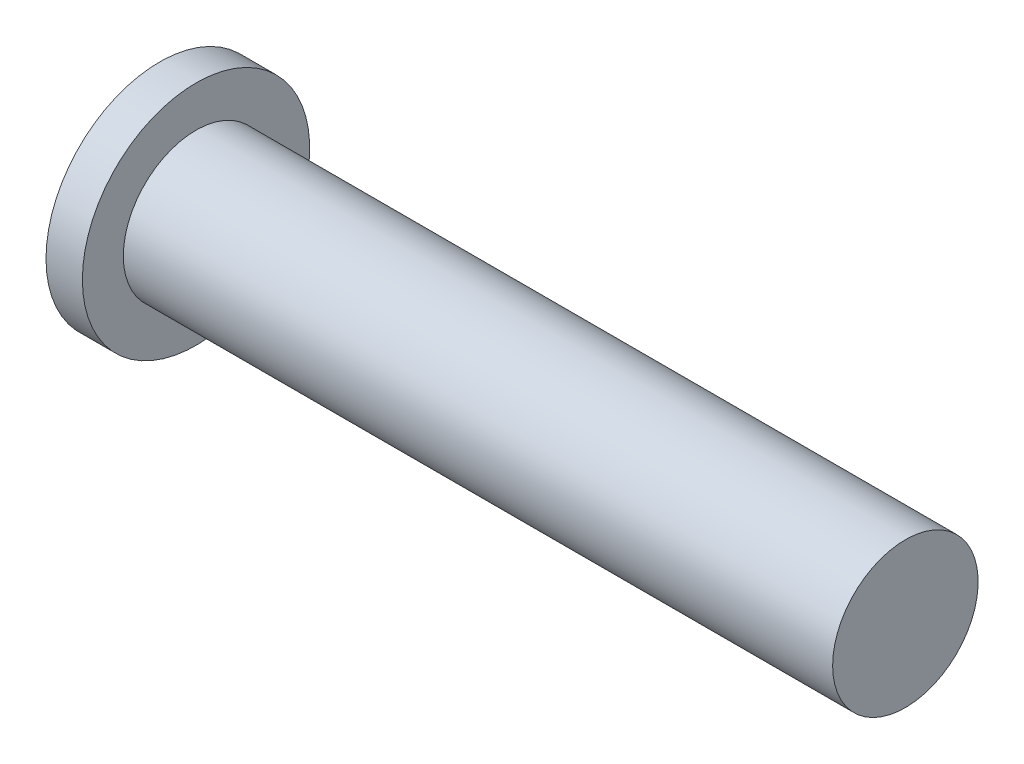
ISO-10303-21;
HEADER;
FILE_DESCRIPTION(('STEP AP214'),'2;1');
FILE_NAME('part.step','',(''),(''),'','','');
FILE_SCHEMA(('AUTOMOTIVE_DESIGN { 1 0 10303 214 1 1 1 1 }'));
ENDSEC;
DATA;
#1=APPLICATION_CONTEXT('core data for automotive mechanical design processes');
#2=APPLICATION_PROTOCOL_DEFINITION('international standard','automotive_design',2000,#1);
#3=PRODUCT_CONTEXT('',#1,'mechanical');
#4=PRODUCT('Part','Part','',(#3));
#5=PRODUCT_RELATED_PRODUCT_CATEGORY('part','',(#4));
#6=PRODUCT_DEFINITION_FORMATION('','',#4);
#7=PRODUCT_DEFINITION_CONTEXT('part definition',#1,'design');
#8=PRODUCT_DEFINITION('design','',#6,#7);
#9=PRODUCT_DEFINITION_SHAPE('','',#8);
#10=(LENGTH_UNIT() NAMED_UNIT(*) SI_UNIT(.MILLI.,.METRE.));
#11=(NAMED_UNIT(*) PLANE_ANGLE_UNIT() SI_UNIT($,.RADIAN.));
#12=(NAMED_UNIT(*) SI_UNIT($,.STERADIAN.) SOLID_ANGLE_UNIT());
#13=UNCERTAINTY_MEASURE_WITH_UNIT(LENGTH_MEASURE(1.E-05),#10,'distance_accuracy_value','');
#14=(GEOMETRIC_REPRESENTATION_CONTEXT(3) GLOBAL_UNCERTAINTY_ASSIGNED_CONTEXT((#13)) GLOBAL_UNIT_ASSIGNED_CONTEXT((#10,
#11,#12)) REPRESENTATION_CONTEXT('',''));
#15=CARTESIAN_POINT('',(0.,0.,0.));
#16=DIRECTION('',(0.,0.,1.));
#17=DIRECTION('',(1.,0.,0.));
#18=AXIS2_PLACEMENT_3D('',#15,#16,#17);
#19=CARTESIAN_POINT('',(0.,0.,0.));
#20=DIRECTION('',(1.,0.,0.));
#21=DIRECTION('',(0.,0.,-1.));
#22=AXIS2_PLACEMENT_3D('',#19,#20,#21);
#23=PLANE('',#22);
#24=CARTESIAN_POINT('',(0.,0.,0.));
#25=DIRECTION('',(-1.,0.,0.));
#26=DIRECTION('',(0.,0.,1.));
#27=AXIS2_PLACEMENT_3D('',#24,#25,#26);
#28=CIRCLE('',#27,6.25);
#29=CARTESIAN_POINT('',(0.,0.,6.25));
#30=VERTEX_POINT('',#29);
#31=EDGE_CURVE('E10',#30,#30,#28,.T.);
#32=ORIENTED_EDGE('',*,*,#31,.T.);
#33=EDGE_LOOP('',(#32));
#34=FACE_BOUND('',#33,.T.);
#35=ADVANCED_FACE('F31',(#34),#23,.F.);
#36=CARTESIAN_POINT('',(0.,0.,0.));
#37=DIRECTION('',(-1.,0.,0.));
#38=DIRECTION('',(0.,0.,1.));
#39=AXIS2_PLACEMENT_3D('',#36,#37,#38);
#40=CYLINDRICAL_SURFACE('',#39,6.25);
#41=ORIENTED_EDGE('',*,*,#31,.F.);
#42=EDGE_LOOP('',(#41));
#43=FACE_BOUND('',#42,.T.);
#44=CARTESIAN_POINT('',(2.,0.,0.));
#45=DIRECTION('',(-1.,0.,0.));
#46=DIRECTION('',(0.,0.,1.));
#47=AXIS2_PLACEMENT_3D('',#44,#45,#46);
#48=CIRCLE('',#47,6.25);
#49=CARTESIAN_POINT('',(2.,0.,6.25));
#50=VERTEX_POINT('',#49);
#51=EDGE_CURVE('E37',#50,#50,#48,.T.);
#52=ORIENTED_EDGE('',*,*,#51,.T.);
#53=EDGE_LOOP('',(#52));
#54=FACE_BOUND('',#53,.T.);
#55=ADVANCED_FACE('F63',(#43,#54),#40,.T.);
#56=CARTESIAN_POINT('',(2.,0.,-6.25));
#57=DIRECTION('',(-1.,0.,0.));
#58=DIRECTION('',(0.,0.,1.));
#59=AXIS2_PLACEMENT_3D('',#56,#57,#58);
#60=PLANE('',#59);
#61=ORIENTED_EDGE('',*,*,#51,.F.);
#62=EDGE_LOOP('',(#61));
#63=FACE_BOUND('',#62,.T.);
#64=CARTESIAN_POINT('',(2.,0.,0.));
#65=DIRECTION('',(-1.,0.,0.));
#66=DIRECTION('',(0.,0.,1.));
#67=AXIS2_PLACEMENT_3D('',#64,#65,#66);
#68=CIRCLE('',#67,3.99999999999999);
#69=CARTESIAN_POINT('',(2.,0.,3.99999999999999));
#70=VERTEX_POINT('',#69);
#71=EDGE_CURVE('E41',#70,#70,#68,.T.);
#72=ORIENTED_EDGE('',*,*,#71,.T.);
#73=EDGE_LOOP('',(#72));
#74=FACE_BOUND('',#73,.T.);
#75=ADVANCED_FACE('F59',(#63,#74),#60,.F.);
#76=CARTESIAN_POINT('',(0.,0.,0.));
#77=DIRECTION('',(-1.,0.,0.));
#78=DIRECTION('',(0.,0.,1.));
#79=AXIS2_PLACEMENT_3D('',#76,#77,#78);
#80=CYLINDRICAL_SURFACE('',#79,3.99999999999999);
#81=ORIENTED_EDGE('',*,*,#71,.F.);
#82=EDGE_LOOP('',(#81));
#83=FACE_BOUND('',#82,.T.);
#84=CARTESIAN_POINT('',(41.,0.,0.));
#85=DIRECTION('',(-1.,0.,0.));
#86=DIRECTION('',(0.,0.,1.));
#87=AXIS2_PLACEMENT_3D('',#84,#85,#86);
#88=CIRCLE('',#87,3.99999999999999);
#89=CARTESIAN_POINT('',(41.,0.,3.99999999999999));
#90=VERTEX_POINT('',#89);
#91=EDGE_CURVE('E45',#90,#90,#88,.T.);
#92=ORIENTED_EDGE('',*,*,#91,.T.);
#93=EDGE_LOOP('',(#92));
#94=FACE_BOUND('',#93,.T.);
#95=ADVANCED_FACE('F51',(#83,#94),#80,.T.);
#96=CARTESIAN_POINT('',(41.,0.,-3.99999999999999));
#97=DIRECTION('',(-1.,0.,0.));
#98=DIRECTION('',(0.,0.,1.));
#99=AXIS2_PLACEMENT_3D('',#96,#97,#98);
#100=PLANE('',#99);
#101=ORIENTED_EDGE('',*,*,#91,.F.);
#102=EDGE_LOOP('',(#101));
#103=FACE_BOUND('',#102,.T.);
#104=ADVANCED_FACE('F53',(#103),#100,.F.);
#105=CLOSED_SHELL('',(#35,#55,#75,#95,#104));
#106=MANIFOLD_SOLID_BREP('B2',#105);
#107=ADVANCED_BREP_SHAPE_REPRESENTATION('',(#18,#106),#14);
#108=SHAPE_DEFINITION_REPRESENTATION(#9,#107);
ENDSEC;
END-ISO-10303-21;
